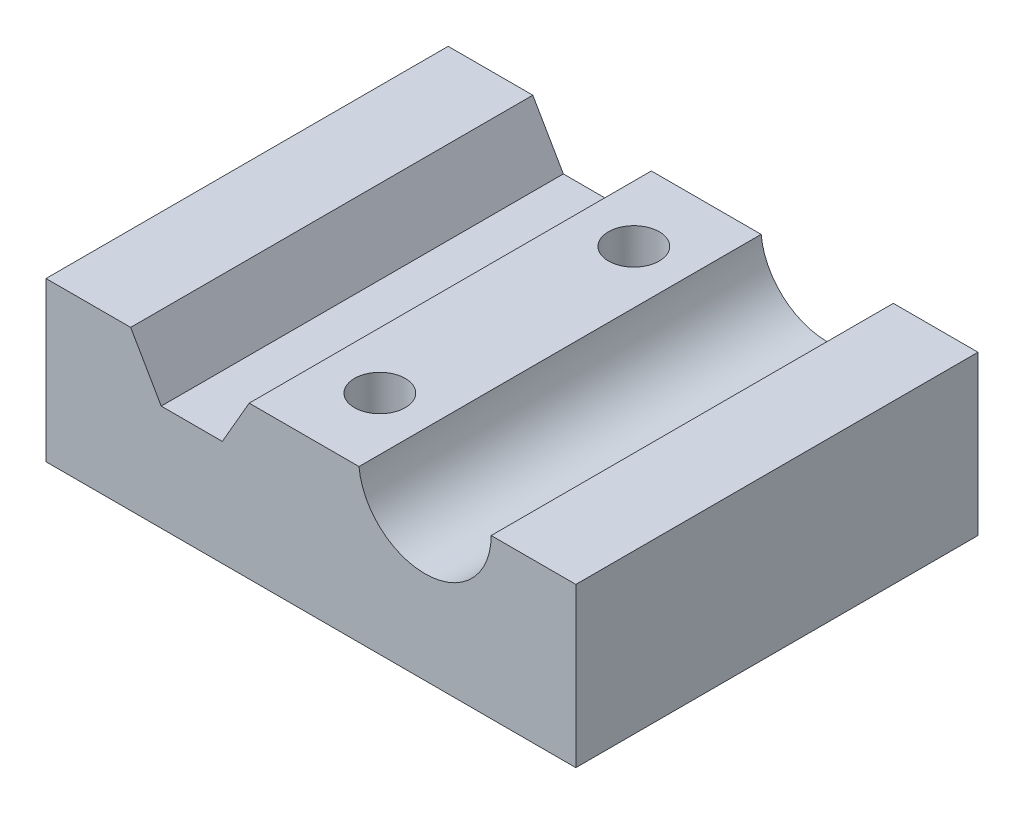
ISO-10303-21;
HEADER;
FILE_DESCRIPTION(('STEP AP214'),'2;1');
FILE_NAME('part.step','',(''),(''),'','','');
FILE_SCHEMA(('AUTOMOTIVE_DESIGN { 1 0 10303 214 1 1 1 1 }'));
ENDSEC;
DATA;
#1=APPLICATION_CONTEXT('core data for automotive mechanical design processes');
#2=APPLICATION_PROTOCOL_DEFINITION('international standard','automotive_design',2000,#1);
#3=PRODUCT_CONTEXT('',#1,'mechanical');
#4=PRODUCT('Part','Part','',(#3));
#5=PRODUCT_RELATED_PRODUCT_CATEGORY('part','',(#4));
#6=PRODUCT_DEFINITION_FORMATION('','',#4);
#7=PRODUCT_DEFINITION_CONTEXT('part definition',#1,'design');
#8=PRODUCT_DEFINITION('design','',#6,#7);
#9=PRODUCT_DEFINITION_SHAPE('','',#8);
#10=(LENGTH_UNIT() NAMED_UNIT(*) SI_UNIT(.MILLI.,.METRE.));
#11=(NAMED_UNIT(*) PLANE_ANGLE_UNIT() SI_UNIT($,.RADIAN.));
#12=(NAMED_UNIT(*) SI_UNIT($,.STERADIAN.) SOLID_ANGLE_UNIT());
#13=UNCERTAINTY_MEASURE_WITH_UNIT(LENGTH_MEASURE(1.E-05),#10,'distance_accuracy_value','');
#14=(GEOMETRIC_REPRESENTATION_CONTEXT(3) GLOBAL_UNCERTAINTY_ASSIGNED_CONTEXT((#13)) GLOBAL_UNIT_ASSIGNED_CONTEXT((#10,
#11,#12)) REPRESENTATION_CONTEXT('',''));
#15=CARTESIAN_POINT('',(0.,0.,0.));
#16=DIRECTION('',(0.,0.,1.));
#17=DIRECTION('',(1.,0.,0.));
#18=AXIS2_PLACEMENT_3D('',#15,#16,#17);
#19=CARTESIAN_POINT('',(0.,0.,0.));
#20=DIRECTION('',(0.,1.,0.));
#21=DIRECTION('',(0.,0.,1.));
#22=AXIS2_PLACEMENT_3D('',#19,#20,#21);
#23=PLANE('',#22);
#24=DIRECTION('',(-1.,0.,0.));
#25=VECTOR('',#24,1.);
#26=CARTESIAN_POINT('',(0.,0.,-12.065));
#27=LINE('',#26,#25);
#28=CARTESIAN_POINT('',(-10.5072017717399,0.,-12.065));
#29=VERTEX_POINT('',#28);
#30=CARTESIAN_POINT('',(-15.5873484187083,0.,-12.065));
#31=VERTEX_POINT('',#30);
#32=EDGE_CURVE('E129',#29,#31,#27,.T.);
#33=ORIENTED_EDGE('',*,*,#32,.T.);
#34=DIRECTION('',(0.,0.,1.));
#35=VECTOR('',#34,1.);
#36=CARTESIAN_POINT('',(-15.5873484187083,0.,12.065));
#37=LINE('',#36,#35);
#38=CARTESIAN_POINT('',(-15.5873484187083,0.,12.065));
#39=VERTEX_POINT('',#38);
#40=EDGE_CURVE('E134',#31,#39,#37,.T.);
#41=ORIENTED_EDGE('',*,*,#40,.T.);
#42=DIRECTION('',(-1.,0.,0.));
#43=VECTOR('',#42,1.);
#44=CARTESIAN_POINT('',(0.,0.,12.065));
#45=LINE('',#44,#43);
#46=CARTESIAN_POINT('',(-10.5072017717399,0.,12.065));
#47=VERTEX_POINT('',#46);
#48=EDGE_CURVE('E181',#47,#39,#45,.T.);
#49=ORIENTED_EDGE('',*,*,#48,.F.);
#50=DIRECTION('',(0.,0.,1.));
#51=VECTOR('',#50,1.);
#52=CARTESIAN_POINT('',(-10.5072017717399,0.,12.065));
#53=LINE('',#52,#51);
#54=EDGE_CURVE('E179',#29,#47,#53,.T.);
#55=ORIENTED_EDGE('',*,*,#54,.F.);
#56=EDGE_LOOP('',(#33,#41,#49,#55));
#57=FACE_BOUND('',#56,.T.);
#58=ADVANCED_FACE('F33',(#57),#23,.T.);
#59=CARTESIAN_POINT('',(16.2052,0.,12.065));
#60=VERTEX_POINT('',#59);
#61=CARTESIAN_POINT('',(11.125199991885,0.,12.065));
#62=VERTEX_POINT('',#61);
#63=EDGE_CURVE('E128',#60,#62,#45,.T.);
#64=ORIENTED_EDGE('',*,*,#63,.F.);
#65=DIRECTION('',(0.,0.,-1.));
#66=VECTOR('',#65,1.);
#67=CARTESIAN_POINT('',(16.2052,0.,12.065));
#68=LINE('',#67,#66);
#69=CARTESIAN_POINT('',(16.2052,0.,-12.065));
#70=VERTEX_POINT('',#69);
#71=EDGE_CURVE('E114',#60,#70,#68,.T.);
#72=ORIENTED_EDGE('',*,*,#71,.T.);
#73=CARTESIAN_POINT('',(11.125199991885,0.,-12.065));
#74=VERTEX_POINT('',#73);
#75=EDGE_CURVE('E124',#70,#74,#27,.T.);
#76=ORIENTED_EDGE('',*,*,#75,.T.);
#77=DIRECTION('',(0.,0.,-1.));
#78=VECTOR('',#77,1.);
#79=CARTESIAN_POINT('',(11.125199991885,0.,12.065));
#80=LINE('',#79,#78);
#81=EDGE_CURVE('E176',#62,#74,#80,.T.);
#82=ORIENTED_EDGE('',*,*,#81,.F.);
#83=EDGE_LOOP('',(#64,#72,#76,#82));
#84=FACE_BOUND('',#83,.T.);
#85=ADVANCED_FACE('F132',(#84),#23,.T.);
#86=CARTESIAN_POINT('',(0.,-9.524746,-7.62));
#87=DIRECTION('',(0.,1.,0.));
#88=DIRECTION('',(0.,0.,1.));
#89=AXIS2_PLACEMENT_3D('',#86,#87,#88);
#90=CYLINDRICAL_SURFACE('',#89,1.524);
#91=CARTESIAN_POINT('',(0.,-0.380999999999999,-7.62));
#92=DIRECTION('',(0.,-1.,0.));
#93=DIRECTION('',(0.,0.,-1.));
#94=AXIS2_PLACEMENT_3D('',#91,#92,#93);
#95=CIRCLE('',#94,1.524);
#96=CARTESIAN_POINT('',(0.,-0.380999999999999,-9.144));
#97=VERTEX_POINT('',#96);
#98=EDGE_CURVE('E171',#97,#97,#95,.F.);
#99=ORIENTED_EDGE('',*,*,#98,.T.);
#100=EDGE_LOOP('',(#99));
#101=FACE_BOUND('',#100,.T.);
#102=CARTESIAN_POINT('',(0.,-9.524746,-7.62));
#103=DIRECTION('',(0.,1.,0.));
#104=DIRECTION('',(0.,0.,1.));
#105=AXIS2_PLACEMENT_3D('',#102,#103,#104);
#106=CIRCLE('',#105,1.524);
#107=CARTESIAN_POINT('',(0.,-9.524746,-6.096));
#108=VERTEX_POINT('',#107);
#109=EDGE_CURVE('E157',#108,#108,#106,.T.);
#110=ORIENTED_EDGE('',*,*,#109,.F.);
#111=EDGE_LOOP('',(#110));
#112=FACE_BOUND('',#111,.T.);
#113=ADVANCED_FACE('F238',(#101,#112),#90,.F.);
#114=CARTESIAN_POINT('',(0.,-9.524746,7.62));
#115=DIRECTION('',(0.,1.,0.));
#116=DIRECTION('',(0.,0.,1.));
#117=AXIS2_PLACEMENT_3D('',#114,#115,#116);
#118=CYLINDRICAL_SURFACE('',#117,1.524);
#119=CARTESIAN_POINT('',(0.,-0.380999999999999,7.62));
#120=DIRECTION('',(0.,-1.,0.));
#121=DIRECTION('',(0.,0.,-1.));
#122=AXIS2_PLACEMENT_3D('',#119,#120,#121);
#123=CIRCLE('',#122,1.524);
#124=CARTESIAN_POINT('',(0.,-0.380999999999999,6.096));
#125=VERTEX_POINT('',#124);
#126=EDGE_CURVE('E174',#125,#125,#123,.F.);
#127=ORIENTED_EDGE('',*,*,#126,.T.);
#128=EDGE_LOOP('',(#127));
#129=FACE_BOUND('',#128,.T.);
#130=CARTESIAN_POINT('',(0.,-9.524746,7.62));
#131=DIRECTION('',(0.,1.,0.));
#132=DIRECTION('',(0.,0.,1.));
#133=AXIS2_PLACEMENT_3D('',#130,#131,#132);
#134=CIRCLE('',#133,1.524);
#135=CARTESIAN_POINT('',(0.,-9.524746,9.144));
#136=VERTEX_POINT('',#135);
#137=EDGE_CURVE('E159',#136,#136,#134,.T.);
#138=ORIENTED_EDGE('',*,*,#137,.F.);
#139=EDGE_LOOP('',(#138));
#140=FACE_BOUND('',#139,.T.);
#141=ADVANCED_FACE('F35',(#129,#140),#118,.F.);
#142=CARTESIAN_POINT('',(-5.00808710467706,-3.17474600000001,12.065));
#143=DIRECTION('',(-0.866025403784438,0.5,0.));
#144=DIRECTION('',(-0.5,-0.866025403784439,0.));
#145=AXIS2_PLACEMENT_3D('',#142,#143,#144);
#146=PLANE('',#145);
#147=DIRECTION('',(0.,0.,1.));
#148=VECTOR('',#147,1.);
#149=CARTESIAN_POINT('',(-3.39511709952962,-0.381,12.065));
#150=LINE('',#149,#148);
#151=CARTESIAN_POINT('',(-3.39511709952962,-0.380999999999999,-12.065));
#152=VERTEX_POINT('',#151);
#153=CARTESIAN_POINT('',(-3.39511709952962,-0.380999999999999,12.065));
#154=VERTEX_POINT('',#153);
#155=EDGE_CURVE('E49',#152,#154,#150,.T.);
#156=ORIENTED_EDGE('',*,*,#155,.F.);
#157=DIRECTION('',(0.5,0.866025403784439,0.));
#158=VECTOR('',#157,1.);
#159=CARTESIAN_POINT('',(-5.00808710467706,-3.17474600000001,-12.065));
#160=LINE('',#159,#158);
#161=CARTESIAN_POINT('',(-5.00808710467706,-3.17474600000001,-12.065));
#162=VERTEX_POINT('',#161);
#163=EDGE_CURVE('E148',#162,#152,#160,.T.);
#164=ORIENTED_EDGE('',*,*,#163,.F.);
#165=DIRECTION('',(0.,0.,-1.));
#166=VECTOR('',#165,1.);
#167=CARTESIAN_POINT('',(-5.00808710467706,-3.17474600000001,12.065));
#168=LINE('',#167,#166);
#169=CARTESIAN_POINT('',(-5.00808710467706,-3.17474600000001,12.065));
#170=VERTEX_POINT('',#169);
#171=EDGE_CURVE('E208',#170,#162,#168,.T.);
#172=ORIENTED_EDGE('',*,*,#171,.F.);
#173=DIRECTION('',(0.5,0.866025403784439,0.));
#174=VECTOR('',#173,1.);
#175=CARTESIAN_POINT('',(-5.00808710467706,-3.17474600000001,12.065));
#176=LINE('',#175,#174);
#177=EDGE_CURVE('E210',#170,#154,#176,.T.);
#178=ORIENTED_EDGE('',*,*,#177,.T.);
#179=EDGE_LOOP('',(#156,#164,#172,#178));
#180=FACE_BOUND('',#179,.T.);
#181=ADVANCED_FACE('F219',(#180),#146,.T.);
#182=CARTESIAN_POINT('',(-15.5873484187083,-9.524746,12.065));
#183=DIRECTION('',(0.,1.,0.));
#184=DIRECTION('',(0.,0.,1.));
#185=AXIS2_PLACEMENT_3D('',#182,#183,#184);
#186=PLANE('',#185);
#187=ORIENTED_EDGE('',*,*,#137,.T.);
#188=EDGE_LOOP('',(#187));
#189=FACE_BOUND('',#188,.T.);
#190=ORIENTED_EDGE('',*,*,#109,.T.);
#191=EDGE_LOOP('',(#190));
#192=FACE_BOUND('',#191,.T.);
#193=DIRECTION('',(1.,0.,0.));
#194=VECTOR('',#193,1.);
#195=CARTESIAN_POINT('',(-15.5873484187083,-9.524746,-12.065));
#196=LINE('',#195,#194);
#197=CARTESIAN_POINT('',(-15.5873484187083,-9.524746,-12.065));
#198=VERTEX_POINT('',#197);
#199=CARTESIAN_POINT('',(16.2052,-9.524746,-12.065));
#200=VERTEX_POINT('',#199);
#201=EDGE_CURVE('E119',#198,#200,#196,.T.);
#202=ORIENTED_EDGE('',*,*,#201,.T.);
#203=DIRECTION('',(0.,0.,-1.));
#204=VECTOR('',#203,1.);
#205=CARTESIAN_POINT('',(16.2052,-9.524746,12.065));
#206=LINE('',#205,#204);
#207=CARTESIAN_POINT('',(16.2052,-9.524746,12.065));
#208=VERTEX_POINT('',#207);
#209=EDGE_CURVE('E116',#208,#200,#206,.T.);
#210=ORIENTED_EDGE('',*,*,#209,.F.);
#211=DIRECTION('',(1.,0.,0.));
#212=VECTOR('',#211,1.);
#213=CARTESIAN_POINT('',(-15.5873484187083,-9.524746,12.065));
#214=LINE('',#213,#212);
#215=CARTESIAN_POINT('',(-15.5873484187083,-9.524746,12.065));
#216=VERTEX_POINT('',#215);
#217=EDGE_CURVE('E141',#216,#208,#214,.T.);
#218=ORIENTED_EDGE('',*,*,#217,.F.);
#219=DIRECTION('',(0.,0.,-1.));
#220=VECTOR('',#219,1.);
#221=CARTESIAN_POINT('',(-15.5873484187083,-9.524746,12.065));
#222=LINE('',#221,#220);
#223=EDGE_CURVE('E178',#216,#198,#222,.T.);
#224=ORIENTED_EDGE('',*,*,#223,.T.);
#225=EDGE_LOOP('',(#202,#210,#218,#224));
#226=FACE_BOUND('',#225,.T.);
#227=ADVANCED_FACE('F225',(#189,#192,#226),#186,.F.);
#228=CARTESIAN_POINT('',(-8.6742613140312,-3.17474600000001,12.065));
#229=DIRECTION('',(0.,1.,0.));
#230=DIRECTION('',(0.,0.,1.));
#231=AXIS2_PLACEMENT_3D('',#228,#229,#230);
#232=PLANE('',#231);
#233=DIRECTION('',(1.,0.,0.));
#234=VECTOR('',#233,1.);
#235=CARTESIAN_POINT('',(-8.6742613140312,-3.17474600000001,-12.065));
#236=LINE('',#235,#234);
#237=CARTESIAN_POINT('',(-8.6742613140312,-3.17474600000001,-12.065));
#238=VERTEX_POINT('',#237);
#239=EDGE_CURVE('E152',#238,#162,#236,.T.);
#240=ORIENTED_EDGE('',*,*,#239,.F.);
#241=DIRECTION('',(0.,0.,-1.));
#242=VECTOR('',#241,1.);
#243=CARTESIAN_POINT('',(-8.6742613140312,-3.17474600000001,12.065));
#244=LINE('',#243,#242);
#245=CARTESIAN_POINT('',(-8.6742613140312,-3.17474600000001,12.065));
#246=VERTEX_POINT('',#245);
#247=EDGE_CURVE('E145',#246,#238,#244,.T.);
#248=ORIENTED_EDGE('',*,*,#247,.F.);
#249=DIRECTION('',(1.,0.,0.));
#250=VECTOR('',#249,1.);
#251=CARTESIAN_POINT('',(-8.6742613140312,-3.17474600000001,12.065));
#252=LINE('',#251,#250);
#253=EDGE_CURVE('E149',#246,#170,#252,.T.);
#254=ORIENTED_EDGE('',*,*,#253,.T.);
#255=ORIENTED_EDGE('',*,*,#171,.T.);
#256=EDGE_LOOP('',(#240,#248,#254,#255));
#257=FACE_BOUND('',#256,.T.);
#258=ADVANCED_FACE('F205',(#257),#232,.T.);
#259=CARTESIAN_POINT('',(-6.35,-0.381,-12.065));
#260=DIRECTION('',(0.,-1.,0.));
#261=DIRECTION('',(0.,0.,-1.));
#262=AXIS2_PLACEMENT_3D('',#259,#260,#261);
#263=PLANE('',#262);
#264=ORIENTED_EDGE('',*,*,#155,.T.);
#265=DIRECTION('',(1.,0.,0.));
#266=VECTOR('',#265,1.);
#267=CARTESIAN_POINT('',(-6.35,-0.381,12.065));
#268=LINE('',#267,#266);
#269=CARTESIAN_POINT('',(3.19332537949355,-0.381,12.065));
#270=VERTEX_POINT('',#269);
#271=EDGE_CURVE('E11',#154,#270,#268,.T.);
#272=ORIENTED_EDGE('',*,*,#271,.T.);
#273=DIRECTION('',(0.,0.,-1.));
#274=VECTOR('',#273,1.);
#275=CARTESIAN_POINT('',(3.19332537949355,-0.381,12.065));
#276=LINE('',#275,#274);
#277=CARTESIAN_POINT('',(3.19332537949355,-0.381,-12.065));
#278=VERTEX_POINT('',#277);
#279=EDGE_CURVE('E169',#270,#278,#276,.T.);
#280=ORIENTED_EDGE('',*,*,#279,.T.);
#281=DIRECTION('',(1.,0.,0.));
#282=VECTOR('',#281,1.);
#283=CARTESIAN_POINT('',(-6.35,-0.381,-12.065));
#284=LINE('',#283,#282);
#285=EDGE_CURVE('E42',#152,#278,#284,.T.);
#286=ORIENTED_EDGE('',*,*,#285,.F.);
#287=EDGE_LOOP('',(#264,#272,#280,#286));
#288=FACE_BOUND('',#287,.T.);
#289=ORIENTED_EDGE('',*,*,#126,.F.);
#290=EDGE_LOOP('',(#289));
#291=FACE_BOUND('',#290,.T.);
#292=ORIENTED_EDGE('',*,*,#98,.F.);
#293=EDGE_LOOP('',(#292));
#294=FACE_BOUND('',#293,.T.);
#295=ADVANCED_FACE('F221',(#288,#291,#294),#263,.F.);
#296=CARTESIAN_POINT('',(0.,0.,-12.065));
#297=DIRECTION('',(0.,0.,1.));
#298=DIRECTION('',(1.,0.,0.));
#299=AXIS2_PLACEMENT_3D('',#296,#297,#298);
#300=PLANE('',#299);
#301=ORIENTED_EDGE('',*,*,#75,.F.);
#302=DIRECTION('',(0.,1.,0.));
#303=VECTOR('',#302,1.);
#304=CARTESIAN_POINT('',(16.2052,9.52525400000001,-12.065));
#305=LINE('',#304,#303);
#306=EDGE_CURVE('E109',#200,#70,#305,.T.);
#307=ORIENTED_EDGE('',*,*,#306,.F.);
#308=ORIENTED_EDGE('',*,*,#201,.F.);
#309=DIRECTION('',(0.,-1.,0.));
#310=VECTOR('',#309,1.);
#311=CARTESIAN_POINT('',(-15.5873484187083,9.52525400000001,-12.065));
#312=LINE('',#311,#310);
#313=EDGE_CURVE('E143',#31,#198,#312,.T.);
#314=ORIENTED_EDGE('',*,*,#313,.F.);
#315=ORIENTED_EDGE('',*,*,#32,.F.);
#316=DIRECTION('',(0.5,-0.866025403784439,0.));
#317=VECTOR('',#316,1.);
#318=CARTESIAN_POINT('',(-10.5073484187083,0.000254000000001614,-12.065));
#319=LINE('',#318,#317);
#320=EDGE_CURVE('E150',#29,#238,#319,.T.);
#321=ORIENTED_EDGE('',*,*,#320,.T.);
#322=ORIENTED_EDGE('',*,*,#239,.T.);
#323=ORIENTED_EDGE('',*,*,#163,.T.);
#324=ORIENTED_EDGE('',*,*,#285,.T.);
#325=CARTESIAN_POINT('',(7.1501,0.000254000000000001,-12.065));
#326=DIRECTION('',(0.,0.,1.));
#327=DIRECTION('',(1.,0.,0.));
#328=AXIS2_PLACEMENT_3D('',#325,#326,#327);
#329=CIRCLE('',#328,3.97509999999999);
#330=EDGE_CURVE('E37',#278,#74,#329,.T.);
#331=ORIENTED_EDGE('',*,*,#330,.T.);
#332=EDGE_LOOP('',(#301,#307,#308,#314,#315,#321,#322,#323,#324,#331));
#333=FACE_BOUND('',#332,.T.);
#334=ADVANCED_FACE('F125',(#333),#300,.F.);
#335=CARTESIAN_POINT('',(0.,0.,12.065));
#336=DIRECTION('',(0.,0.,1.));
#337=DIRECTION('',(1.,0.,0.));
#338=AXIS2_PLACEMENT_3D('',#335,#336,#337);
#339=PLANE('',#338);
#340=DIRECTION('',(0.,1.,0.));
#341=VECTOR('',#340,1.);
#342=CARTESIAN_POINT('',(16.2052,9.52525400000001,12.065));
#343=LINE('',#342,#341);
#344=EDGE_CURVE('E139',#208,#60,#343,.T.);
#345=ORIENTED_EDGE('',*,*,#344,.T.);
#346=ORIENTED_EDGE('',*,*,#63,.T.);
#347=CARTESIAN_POINT('',(7.1501,0.000254000000000001,12.065));
#348=DIRECTION('',(0.,0.,1.));
#349=DIRECTION('',(1.,0.,0.));
#350=AXIS2_PLACEMENT_3D('',#347,#348,#349);
#351=CIRCLE('',#350,3.97509999999999);
#352=EDGE_CURVE('E151',#270,#62,#351,.T.);
#353=ORIENTED_EDGE('',*,*,#352,.F.);
#354=ORIENTED_EDGE('',*,*,#271,.F.);
#355=ORIENTED_EDGE('',*,*,#177,.F.);
#356=ORIENTED_EDGE('',*,*,#253,.F.);
#357=DIRECTION('',(0.5,-0.866025403784439,0.));
#358=VECTOR('',#357,1.);
#359=CARTESIAN_POINT('',(-10.5073484187083,0.000254000000001614,12.065));
#360=LINE('',#359,#358);
#361=EDGE_CURVE('E146',#47,#246,#360,.T.);
#362=ORIENTED_EDGE('',*,*,#361,.F.);
#363=ORIENTED_EDGE('',*,*,#48,.T.);
#364=DIRECTION('',(0.,-1.,0.));
#365=VECTOR('',#364,1.);
#366=CARTESIAN_POINT('',(-15.5873484187083,9.52525400000001,12.065));
#367=LINE('',#366,#365);
#368=EDGE_CURVE('E120',#39,#216,#367,.T.);
#369=ORIENTED_EDGE('',*,*,#368,.T.);
#370=ORIENTED_EDGE('',*,*,#217,.T.);
#371=EDGE_LOOP('',(#345,#346,#353,#354,#355,#356,#362,#363,#369,#370));
#372=FACE_BOUND('',#371,.T.);
#373=ADVANCED_FACE('F196',(#372),#339,.T.);
#374=CARTESIAN_POINT('',(7.1501,0.000254000000000001,12.065));
#375=DIRECTION('',(0.,0.,-1.));
#376=DIRECTION('',(-1.,0.,0.));
#377=AXIS2_PLACEMENT_3D('',#374,#375,#376);
#378=CYLINDRICAL_SURFACE('',#377,3.97509999999999);
#379=ORIENTED_EDGE('',*,*,#352,.T.);
#380=ORIENTED_EDGE('',*,*,#81,.T.);
#381=ORIENTED_EDGE('',*,*,#330,.F.);
#382=ORIENTED_EDGE('',*,*,#279,.F.);
#383=EDGE_LOOP('',(#379,#380,#381,#382));
#384=FACE_BOUND('',#383,.T.);
#385=ADVANCED_FACE('F223',(#384),#378,.F.);
#386=CARTESIAN_POINT('',(-10.5073484187083,0.000254000000001614,12.065));
#387=DIRECTION('',(0.866025403784439,0.5,0.));
#388=DIRECTION('',(-0.5,0.866025403784439,0.));
#389=AXIS2_PLACEMENT_3D('',#386,#387,#388);
#390=PLANE('',#389);
#391=ORIENTED_EDGE('',*,*,#320,.F.);
#392=ORIENTED_EDGE('',*,*,#54,.T.);
#393=ORIENTED_EDGE('',*,*,#361,.T.);
#394=ORIENTED_EDGE('',*,*,#247,.T.);
#395=EDGE_LOOP('',(#391,#392,#393,#394));
#396=FACE_BOUND('',#395,.T.);
#397=ADVANCED_FACE('F202',(#396),#390,.T.);
#398=CARTESIAN_POINT('',(16.2052,9.52525400000001,12.065));
#399=DIRECTION('',(-1.,0.,0.));
#400=DIRECTION('',(0.,-1.,0.));
#401=AXIS2_PLACEMENT_3D('',#398,#399,#400);
#402=PLANE('',#401);
#403=ORIENTED_EDGE('',*,*,#71,.F.);
#404=ORIENTED_EDGE('',*,*,#344,.F.);
#405=ORIENTED_EDGE('',*,*,#209,.T.);
#406=ORIENTED_EDGE('',*,*,#306,.T.);
#407=EDGE_LOOP('',(#403,#404,#405,#406));
#408=FACE_BOUND('',#407,.T.);
#409=ADVANCED_FACE('F111',(#408),#402,.F.);
#410=CARTESIAN_POINT('',(-15.5873484187083,9.52525400000001,12.065));
#411=DIRECTION('',(1.,0.,0.));
#412=DIRECTION('',(0.,1.,0.));
#413=AXIS2_PLACEMENT_3D('',#410,#411,#412);
#414=PLANE('',#413);
#415=ORIENTED_EDGE('',*,*,#40,.F.);
#416=ORIENTED_EDGE('',*,*,#313,.T.);
#417=ORIENTED_EDGE('',*,*,#223,.F.);
#418=ORIENTED_EDGE('',*,*,#368,.F.);
#419=EDGE_LOOP('',(#415,#416,#417,#418));
#420=FACE_BOUND('',#419,.T.);
#421=ADVANCED_FACE('F189',(#420),#414,.F.);
#422=CLOSED_SHELL('',(#58,#85,#113,#141,#181,#227,#258,#295,#334,#373,#385,#397,#409,#421));
#423=MANIFOLD_SOLID_BREP('B2',#422);
#424=ADVANCED_BREP_SHAPE_REPRESENTATION('',(#18,#423),#14);
#425=SHAPE_DEFINITION_REPRESENTATION(#9,#424);
ENDSEC;
END-ISO-10303-21;
